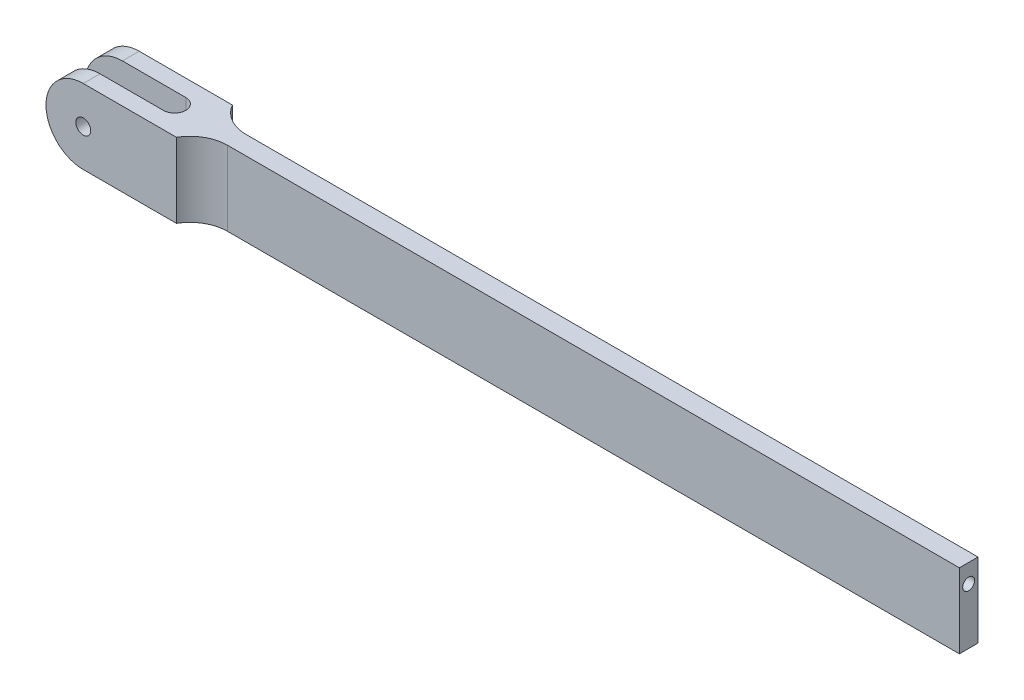
ISO-10303-21;
HEADER;
FILE_DESCRIPTION(('STEP AP214'),'2;1');
FILE_NAME('part.step','',(''),(''),'','','');
FILE_SCHEMA(('AUTOMOTIVE_DESIGN { 1 0 10303 214 1 1 1 1 }'));
ENDSEC;
DATA;
#1=APPLICATION_CONTEXT('core data for automotive mechanical design processes');
#2=APPLICATION_PROTOCOL_DEFINITION('international standard','automotive_design',2000,#1);
#3=PRODUCT_CONTEXT('',#1,'mechanical');
#4=PRODUCT('Part','Part','',(#3));
#5=PRODUCT_RELATED_PRODUCT_CATEGORY('part','',(#4));
#6=PRODUCT_DEFINITION_FORMATION('','',#4);
#7=PRODUCT_DEFINITION_CONTEXT('part definition',#1,'design');
#8=PRODUCT_DEFINITION('design','',#6,#7);
#9=PRODUCT_DEFINITION_SHAPE('','',#8);
#10=(LENGTH_UNIT() NAMED_UNIT(*) SI_UNIT(.MILLI.,.METRE.));
#11=(NAMED_UNIT(*) PLANE_ANGLE_UNIT() SI_UNIT($,.RADIAN.));
#12=(NAMED_UNIT(*) SI_UNIT($,.STERADIAN.) SOLID_ANGLE_UNIT());
#13=UNCERTAINTY_MEASURE_WITH_UNIT(LENGTH_MEASURE(1.E-05),#10,'distance_accuracy_value','');
#14=(GEOMETRIC_REPRESENTATION_CONTEXT(3) GLOBAL_UNCERTAINTY_ASSIGNED_CONTEXT((#13)) GLOBAL_UNIT_ASSIGNED_CONTEXT((#10,
#11,#12)) REPRESENTATION_CONTEXT('',''));
#15=CARTESIAN_POINT('',(0.,0.,0.));
#16=DIRECTION('',(0.,0.,1.));
#17=DIRECTION('',(1.,0.,0.));
#18=AXIS2_PLACEMENT_3D('',#15,#16,#17);
#19=CARTESIAN_POINT('',(0.,0.,5.));
#20=DIRECTION('',(0.,0.,-1.));
#21=DIRECTION('',(-1.,0.,0.));
#22=AXIS2_PLACEMENT_3D('',#19,#20,#21);
#23=CYLINDRICAL_SURFACE('',#22,10.);
#24=DIRECTION('',(0.,0.,-1.));
#25=VECTOR('',#24,1.);
#26=CARTESIAN_POINT('',(0.,10.,5.));
#27=LINE('',#26,#25);
#28=CARTESIAN_POINT('',(0.,10.,10.));
#29=VERTEX_POINT('',#28);
#30=CARTESIAN_POINT('',(0.,10.,5.5));
#31=VERTEX_POINT('',#30);
#32=EDGE_CURVE('E159',#29,#31,#27,.T.);
#33=ORIENTED_EDGE('',*,*,#32,.T.);
#34=CARTESIAN_POINT('',(0.,0.,5.5));
#35=DIRECTION('',(0.,0.,1.));
#36=DIRECTION('',(1.,0.,0.));
#37=AXIS2_PLACEMENT_3D('',#34,#35,#36);
#38=CIRCLE('',#37,10.);
#39=CARTESIAN_POINT('',(0.,-10.,5.5));
#40=VERTEX_POINT('',#39);
#41=EDGE_CURVE('E187',#31,#40,#38,.T.);
#42=ORIENTED_EDGE('',*,*,#41,.T.);
#43=DIRECTION('',(0.,0.,-1.));
#44=VECTOR('',#43,1.);
#45=CARTESIAN_POINT('',(0.,-10.,5.));
#46=LINE('',#45,#44);
#47=CARTESIAN_POINT('',(0.,-10.,10.));
#48=VERTEX_POINT('',#47);
#49=EDGE_CURVE('E177',#48,#40,#46,.T.);
#50=ORIENTED_EDGE('',*,*,#49,.F.);
#51=CARTESIAN_POINT('',(0.,0.,10.));
#52=DIRECTION('',(0.,0.,1.));
#53=DIRECTION('',(1.,0.,0.));
#54=AXIS2_PLACEMENT_3D('',#51,#52,#53);
#55=CIRCLE('',#54,10.);
#56=EDGE_CURVE('E234',#29,#48,#55,.T.);
#57=ORIENTED_EDGE('',*,*,#56,.F.);
#58=EDGE_LOOP('',(#33,#42,#50,#57));
#59=FACE_BOUND('',#58,.T.);
#60=ADVANCED_FACE('F41',(#59),#23,.T.);
#61=CARTESIAN_POINT('',(0.,10.,5.));
#62=DIRECTION('',(0.,-1.,0.));
#63=DIRECTION('',(1.,0.,0.));
#64=AXIS2_PLACEMENT_3D('',#61,#62,#63);
#65=PLANE('',#64);
#66=CARTESIAN_POINT('',(17.,10.,2.5));
#67=DIRECTION('',(0.,-1.,0.));
#68=DIRECTION('',(1.,0.,0.));
#69=AXIS2_PLACEMENT_3D('',#66,#67,#68);
#70=CIRCLE('',#69,3.);
#71=CARTESIAN_POINT('',(17.,10.,-0.5));
#72=VERTEX_POINT('',#71);
#73=CARTESIAN_POINT('',(20.,10.,2.5));
#74=VERTEX_POINT('',#73);
#75=EDGE_CURVE('E63',#72,#74,#70,.T.);
#76=ORIENTED_EDGE('',*,*,#75,.T.);
#77=CARTESIAN_POINT('',(17.,10.,2.5));
#78=DIRECTION('',(0.,-1.,0.));
#79=DIRECTION('',(1.,0.,0.));
#80=AXIS2_PLACEMENT_3D('',#77,#78,#79);
#81=CIRCLE('',#80,3.);
#82=CARTESIAN_POINT('',(17.,10.,5.5));
#83=VERTEX_POINT('',#82);
#84=EDGE_CURVE('E49',#74,#83,#81,.T.);
#85=ORIENTED_EDGE('',*,*,#84,.T.);
#86=DIRECTION('',(1.,0.,0.));
#87=VECTOR('',#86,1.);
#88=CARTESIAN_POINT('',(-20.,10.,5.5));
#89=LINE('',#88,#87);
#90=EDGE_CURVE('E144',#31,#83,#89,.T.);
#91=ORIENTED_EDGE('',*,*,#90,.F.);
#92=ORIENTED_EDGE('',*,*,#32,.F.);
#93=DIRECTION('',(-1.,0.,0.));
#94=VECTOR('',#93,1.);
#95=CARTESIAN_POINT('',(0.,10.,10.));
#96=LINE('',#95,#94);
#97=CARTESIAN_POINT('',(25.,10.,10.));
#98=VERTEX_POINT('',#97);
#99=EDGE_CURVE('E226',#98,#29,#96,.T.);
#100=ORIENTED_EDGE('',*,*,#99,.F.);
#101=CARTESIAN_POINT('',(33.6602540378444,10.,15.));
#102=DIRECTION('',(0.,-1.,0.));
#103=DIRECTION('',(1.,0.,0.));
#104=AXIS2_PLACEMENT_3D('',#101,#102,#103);
#105=CIRCLE('',#104,10.);
#106=CARTESIAN_POINT('',(33.6602540378444,10.,5.));
#107=VERTEX_POINT('',#106);
#108=EDGE_CURVE('E194',#98,#107,#105,.T.);
#109=ORIENTED_EDGE('',*,*,#108,.T.);
#110=DIRECTION('',(-1.,0.,0.));
#111=VECTOR('',#110,1.);
#112=CARTESIAN_POINT('',(0.,10.,5.));
#113=LINE('',#112,#111);
#114=CARTESIAN_POINT('',(230.,10.,5.));
#115=VERTEX_POINT('',#114);
#116=EDGE_CURVE('E161',#115,#107,#113,.T.);
#117=ORIENTED_EDGE('',*,*,#116,.F.);
#118=DIRECTION('',(0.,0.,-1.));
#119=VECTOR('',#118,1.);
#120=CARTESIAN_POINT('',(230.,10.,5.));
#121=LINE('',#120,#119);
#122=CARTESIAN_POINT('',(230.,10.,0.));
#123=VERTEX_POINT('',#122);
#124=EDGE_CURVE('E163',#115,#123,#121,.T.);
#125=ORIENTED_EDGE('',*,*,#124,.T.);
#126=DIRECTION('',(-1.,0.,0.));
#127=VECTOR('',#126,1.);
#128=CARTESIAN_POINT('',(0.,10.,0.));
#129=LINE('',#128,#127);
#130=CARTESIAN_POINT('',(33.6602540378444,10.,0.));
#131=VERTEX_POINT('',#130);
#132=EDGE_CURVE('E168',#123,#131,#129,.T.);
#133=ORIENTED_EDGE('',*,*,#132,.T.);
#134=CARTESIAN_POINT('',(33.6602540378444,10.,-10.));
#135=DIRECTION('',(0.,-1.,0.));
#136=DIRECTION('',(1.,0.,0.));
#137=AXIS2_PLACEMENT_3D('',#134,#135,#136);
#138=CIRCLE('',#137,10.);
#139=CARTESIAN_POINT('',(25.,10.,-5.));
#140=VERTEX_POINT('',#139);
#141=EDGE_CURVE('E197',#131,#140,#138,.T.);
#142=ORIENTED_EDGE('',*,*,#141,.T.);
#143=DIRECTION('',(-1.,0.,0.));
#144=VECTOR('',#143,1.);
#145=CARTESIAN_POINT('',(0.,10.,-5.));
#146=LINE('',#145,#144);
#147=CARTESIAN_POINT('',(0.,10.,-5.));
#148=VERTEX_POINT('',#147);
#149=EDGE_CURVE('E157',#140,#148,#146,.T.);
#150=ORIENTED_EDGE('',*,*,#149,.T.);
#151=CARTESIAN_POINT('',(0.,10.,-0.5));
#152=VERTEX_POINT('',#151);
#153=EDGE_CURVE('E147',#152,#148,#27,.T.);
#154=ORIENTED_EDGE('',*,*,#153,.F.);
#155=DIRECTION('',(-1.,0.,0.));
#156=VECTOR('',#155,1.);
#157=CARTESIAN_POINT('',(-20.,10.,-0.5));
#158=LINE('',#157,#156);
#159=EDGE_CURVE('E136',#72,#152,#158,.T.);
#160=ORIENTED_EDGE('',*,*,#159,.F.);
#161=EDGE_LOOP('',(#76,#85,#91,#92,#100,#109,#117,#125,#133,#142,#150,#154,#160));
#162=FACE_BOUND('',#161,.T.);
#163=ADVANCED_FACE('F160',(#162),#65,.F.);
#164=CARTESIAN_POINT('',(0.,0.,5.));
#165=DIRECTION('',(0.,0.,-1.));
#166=DIRECTION('',(-1.,0.,0.));
#167=AXIS2_PLACEMENT_3D('',#164,#165,#166);
#168=CYLINDRICAL_SURFACE('',#167,2.);
#169=CARTESIAN_POINT('',(0.,0.,5.5));
#170=DIRECTION('',(0.,0.,1.));
#171=DIRECTION('',(1.,0.,0.));
#172=AXIS2_PLACEMENT_3D('',#169,#170,#171);
#173=CIRCLE('',#172,2.);
#174=CARTESIAN_POINT('',(2.,0.,5.5));
#175=VERTEX_POINT('',#174);
#176=EDGE_CURVE('E153',#175,#175,#173,.T.);
#177=ORIENTED_EDGE('',*,*,#176,.F.);
#178=EDGE_LOOP('',(#177));
#179=FACE_BOUND('',#178,.T.);
#180=CARTESIAN_POINT('',(0.,0.,10.));
#181=DIRECTION('',(0.,0.,1.));
#182=DIRECTION('',(1.,0.,0.));
#183=AXIS2_PLACEMENT_3D('',#180,#181,#182);
#184=CIRCLE('',#183,2.);
#185=CARTESIAN_POINT('',(2.,0.,10.));
#186=VERTEX_POINT('',#185);
#187=EDGE_CURVE('E239',#186,#186,#184,.F.);
#188=ORIENTED_EDGE('',*,*,#187,.F.);
#189=EDGE_LOOP('',(#188));
#190=FACE_BOUND('',#189,.T.);
#191=ADVANCED_FACE('F287',(#179,#190),#168,.F.);
#192=CARTESIAN_POINT('',(0.,0.,5.));
#193=DIRECTION('',(0.,0.,1.));
#194=DIRECTION('',(1.,0.,0.));
#195=AXIS2_PLACEMENT_3D('',#192,#193,#194);
#196=PLANE('',#195);
#197=ORIENTED_EDGE('',*,*,#116,.T.);
#198=DIRECTION('',(0.,-1.,0.));
#199=VECTOR('',#198,1.);
#200=CARTESIAN_POINT('',(33.6602540378444,-9.99999999999999,5.));
#201=LINE('',#200,#199);
#202=CARTESIAN_POINT('',(33.6602540378444,-10.,5.));
#203=VERTEX_POINT('',#202);
#204=EDGE_CURVE('E180',#107,#203,#201,.T.);
#205=ORIENTED_EDGE('',*,*,#204,.T.);
#206=DIRECTION('',(1.,0.,0.));
#207=VECTOR('',#206,1.);
#208=CARTESIAN_POINT('',(0.,-10.,5.));
#209=LINE('',#208,#207);
#210=CARTESIAN_POINT('',(230.,-9.99999999999997,5.));
#211=VERTEX_POINT('',#210);
#212=EDGE_CURVE('E254',#203,#211,#209,.T.);
#213=ORIENTED_EDGE('',*,*,#212,.T.);
#214=DIRECTION('',(0.,1.,0.));
#215=VECTOR('',#214,1.);
#216=CARTESIAN_POINT('',(230.,10.,5.));
#217=LINE('',#216,#215);
#218=EDGE_CURVE('E167',#211,#115,#217,.T.);
#219=ORIENTED_EDGE('',*,*,#218,.T.);
#220=EDGE_LOOP('',(#197,#205,#213,#219));
#221=FACE_BOUND('',#220,.T.);
#222=ADVANCED_FACE('F276',(#221),#196,.T.);
#223=CARTESIAN_POINT('',(0.,0.,0.));
#224=DIRECTION('',(0.,0.,1.));
#225=DIRECTION('',(1.,0.,0.));
#226=AXIS2_PLACEMENT_3D('',#223,#224,#225);
#227=PLANE('',#226);
#228=DIRECTION('',(1.,0.,0.));
#229=VECTOR('',#228,1.);
#230=CARTESIAN_POINT('',(0.,-10.,0.));
#231=LINE('',#230,#229);
#232=CARTESIAN_POINT('',(33.6602540378444,-10.,0.));
#233=VERTEX_POINT('',#232);
#234=CARTESIAN_POINT('',(230.,-9.99999999999997,0.));
#235=VERTEX_POINT('',#234);
#236=EDGE_CURVE('E255',#233,#235,#231,.T.);
#237=ORIENTED_EDGE('',*,*,#236,.F.);
#238=DIRECTION('',(0.,1.,0.));
#239=VECTOR('',#238,1.);
#240=CARTESIAN_POINT('',(33.6602540378444,0.,0.));
#241=LINE('',#240,#239);
#242=EDGE_CURVE('E189',#233,#131,#241,.T.);
#243=ORIENTED_EDGE('',*,*,#242,.T.);
#244=ORIENTED_EDGE('',*,*,#132,.F.);
#245=DIRECTION('',(0.,1.,0.));
#246=VECTOR('',#245,1.);
#247=CARTESIAN_POINT('',(230.,10.,0.));
#248=LINE('',#247,#246);
#249=EDGE_CURVE('E256',#235,#123,#248,.T.);
#250=ORIENTED_EDGE('',*,*,#249,.F.);
#251=EDGE_LOOP('',(#237,#243,#244,#250));
#252=FACE_BOUND('',#251,.T.);
#253=ADVANCED_FACE('F280',(#252),#227,.F.);
#254=CARTESIAN_POINT('',(0.,-10.,-0.5));
#255=VERTEX_POINT('',#254);
#256=CARTESIAN_POINT('',(0.,-10.,-5.));
#257=VERTEX_POINT('',#256);
#258=EDGE_CURVE('E155',#255,#257,#46,.T.);
#259=ORIENTED_EDGE('',*,*,#258,.F.);
#260=CARTESIAN_POINT('',(0.,0.,-0.5));
#261=DIRECTION('',(0.,0.,-1.));
#262=DIRECTION('',(-1.,0.,0.));
#263=AXIS2_PLACEMENT_3D('',#260,#261,#262);
#264=CIRCLE('',#263,10.);
#265=EDGE_CURVE('E140',#255,#152,#264,.T.);
#266=ORIENTED_EDGE('',*,*,#265,.T.);
#267=ORIENTED_EDGE('',*,*,#153,.T.);
#268=CARTESIAN_POINT('',(0.,0.,-5.));
#269=DIRECTION('',(0.,0.,1.));
#270=DIRECTION('',(1.,0.,0.));
#271=AXIS2_PLACEMENT_3D('',#268,#269,#270);
#272=CIRCLE('',#271,10.);
#273=EDGE_CURVE('E246',#148,#257,#272,.T.);
#274=ORIENTED_EDGE('',*,*,#273,.T.);
#275=EDGE_LOOP('',(#259,#266,#267,#274));
#276=FACE_BOUND('',#275,.T.);
#277=ADVANCED_FACE('F146',(#276),#23,.T.);
#278=CARTESIAN_POINT('',(0.,-10.,5.));
#279=DIRECTION('',(0.,1.,0.));
#280=DIRECTION('',(-1.,0.,0.));
#281=AXIS2_PLACEMENT_3D('',#278,#279,#280);
#282=PLANE('',#281);
#283=ORIENTED_EDGE('',*,*,#49,.T.);
#284=DIRECTION('',(1.,0.,0.));
#285=VECTOR('',#284,1.);
#286=CARTESIAN_POINT('',(-20.,-10.,5.5));
#287=LINE('',#286,#285);
#288=CARTESIAN_POINT('',(17.,-10.,5.5));
#289=VERTEX_POINT('',#288);
#290=EDGE_CURVE('E181',#40,#289,#287,.T.);
#291=ORIENTED_EDGE('',*,*,#290,.T.);
#292=CARTESIAN_POINT('',(17.,-10.,2.5));
#293=DIRECTION('',(0.,1.,0.));
#294=DIRECTION('',(-1.,0.,0.));
#295=AXIS2_PLACEMENT_3D('',#292,#293,#294);
#296=CIRCLE('',#295,3.);
#297=CARTESIAN_POINT('',(20.,-10.,2.5));
#298=VERTEX_POINT('',#297);
#299=EDGE_CURVE('E11',#289,#298,#296,.T.);
#300=ORIENTED_EDGE('',*,*,#299,.T.);
#301=CARTESIAN_POINT('',(17.,-10.,2.5));
#302=DIRECTION('',(0.,1.,0.));
#303=DIRECTION('',(-1.,0.,0.));
#304=AXIS2_PLACEMENT_3D('',#301,#302,#303);
#305=CIRCLE('',#304,3.);
#306=CARTESIAN_POINT('',(17.,-10.,-0.5));
#307=VERTEX_POINT('',#306);
#308=EDGE_CURVE('E201',#298,#307,#305,.T.);
#309=ORIENTED_EDGE('',*,*,#308,.T.);
#310=DIRECTION('',(-1.,0.,0.));
#311=VECTOR('',#310,1.);
#312=CARTESIAN_POINT('',(-20.,-10.,-0.5));
#313=LINE('',#312,#311);
#314=EDGE_CURVE('E213',#307,#255,#313,.T.);
#315=ORIENTED_EDGE('',*,*,#314,.T.);
#316=ORIENTED_EDGE('',*,*,#258,.T.);
#317=DIRECTION('',(1.,0.,0.));
#318=VECTOR('',#317,1.);
#319=CARTESIAN_POINT('',(0.,-10.,-5.));
#320=LINE('',#319,#318);
#321=CARTESIAN_POINT('',(25.,-10.,-5.));
#322=VERTEX_POINT('',#321);
#323=EDGE_CURVE('E249',#257,#322,#320,.T.);
#324=ORIENTED_EDGE('',*,*,#323,.T.);
#325=CARTESIAN_POINT('',(33.6602540378444,-10.,-10.));
#326=DIRECTION('',(0.,1.,0.));
#327=DIRECTION('',(-1.,0.,0.));
#328=AXIS2_PLACEMENT_3D('',#325,#326,#327);
#329=CIRCLE('',#328,10.);
#330=EDGE_CURVE('E195',#322,#233,#329,.T.);
#331=ORIENTED_EDGE('',*,*,#330,.T.);
#332=ORIENTED_EDGE('',*,*,#236,.T.);
#333=DIRECTION('',(0.,0.,-1.));
#334=VECTOR('',#333,1.);
#335=CARTESIAN_POINT('',(230.,-9.99999999999997,5.));
#336=LINE('',#335,#334);
#337=EDGE_CURVE('E174',#211,#235,#336,.T.);
#338=ORIENTED_EDGE('',*,*,#337,.F.);
#339=ORIENTED_EDGE('',*,*,#212,.F.);
#340=CARTESIAN_POINT('',(33.6602540378444,-10.,15.));
#341=DIRECTION('',(0.,1.,0.));
#342=DIRECTION('',(-1.,0.,0.));
#343=AXIS2_PLACEMENT_3D('',#340,#341,#342);
#344=CIRCLE('',#343,10.);
#345=CARTESIAN_POINT('',(25.,-10.,10.));
#346=VERTEX_POINT('',#345);
#347=EDGE_CURVE('E191',#203,#346,#344,.T.);
#348=ORIENTED_EDGE('',*,*,#347,.T.);
#349=DIRECTION('',(1.,0.,0.));
#350=VECTOR('',#349,1.);
#351=CARTESIAN_POINT('',(0.,-10.,10.));
#352=LINE('',#351,#350);
#353=EDGE_CURVE('E237',#48,#346,#352,.T.);
#354=ORIENTED_EDGE('',*,*,#353,.F.);
#355=EDGE_LOOP('',(#283,#291,#300,#309,#315,#316,#324,#331,#332,#338,#339,#348,#354));
#356=FACE_BOUND('',#355,.T.);
#357=ADVANCED_FACE('F218',(#356),#282,.F.);
#358=CARTESIAN_POINT('',(230.,10.,5.));
#359=DIRECTION('',(-1.,0.,0.));
#360=DIRECTION('',(0.,0.,1.));
#361=AXIS2_PLACEMENT_3D('',#358,#359,#360);
#362=PLANE('',#361);
#363=CARTESIAN_POINT('',(230.,5.00000000000003,2.5));
#364=DIRECTION('',(1.,0.,0.));
#365=DIRECTION('',(0.,0.,-1.));
#366=AXIS2_PLACEMENT_3D('',#363,#364,#365);
#367=CIRCLE('',#366,1.6);
#368=CARTESIAN_POINT('',(230.,5.00000000000003,0.9));
#369=VERTEX_POINT('',#368);
#370=EDGE_CURVE('E224',#369,#369,#367,.T.);
#371=ORIENTED_EDGE('',*,*,#370,.F.);
#372=EDGE_LOOP('',(#371));
#373=FACE_BOUND('',#372,.T.);
#374=ORIENTED_EDGE('',*,*,#249,.T.);
#375=ORIENTED_EDGE('',*,*,#124,.F.);
#376=ORIENTED_EDGE('',*,*,#218,.F.);
#377=ORIENTED_EDGE('',*,*,#337,.T.);
#378=EDGE_LOOP('',(#374,#375,#376,#377));
#379=FACE_BOUND('',#378,.T.);
#380=ADVANCED_FACE('F344',(#373,#379),#362,.F.);
#381=CARTESIAN_POINT('',(0.,0.,-5.));
#382=DIRECTION('',(0.,0.,1.));
#383=DIRECTION('',(1.,0.,0.));
#384=AXIS2_PLACEMENT_3D('',#381,#382,#383);
#385=PLANE('',#384);
#386=DIRECTION('',(0.,-1.,0.));
#387=VECTOR('',#386,1.);
#388=CARTESIAN_POINT('',(25.,0.,-5.));
#389=LINE('',#388,#387);
#390=EDGE_CURVE('E245',#140,#322,#389,.T.);
#391=ORIENTED_EDGE('',*,*,#390,.T.);
#392=ORIENTED_EDGE('',*,*,#323,.F.);
#393=ORIENTED_EDGE('',*,*,#273,.F.);
#394=ORIENTED_EDGE('',*,*,#149,.F.);
#395=EDGE_LOOP('',(#391,#392,#393,#394));
#396=FACE_BOUND('',#395,.T.);
#397=CARTESIAN_POINT('',(0.,0.,-5.));
#398=DIRECTION('',(0.,0.,1.));
#399=DIRECTION('',(1.,0.,0.));
#400=AXIS2_PLACEMENT_3D('',#397,#398,#399);
#401=CIRCLE('',#400,2.);
#402=CARTESIAN_POINT('',(2.,0.,-5.));
#403=VERTEX_POINT('',#402);
#404=EDGE_CURVE('E253',#403,#403,#401,.F.);
#405=ORIENTED_EDGE('',*,*,#404,.F.);
#406=EDGE_LOOP('',(#405));
#407=FACE_BOUND('',#406,.T.);
#408=ADVANCED_FACE('F272',(#396,#407),#385,.F.);
#409=CARTESIAN_POINT('',(0.,0.,-0.5));
#410=DIRECTION('',(0.,0.,-1.));
#411=DIRECTION('',(-1.,0.,0.));
#412=AXIS2_PLACEMENT_3D('',#409,#410,#411);
#413=CIRCLE('',#412,2.);
#414=CARTESIAN_POINT('',(-2.,0.,-0.5));
#415=VERTEX_POINT('',#414);
#416=EDGE_CURVE('E152',#415,#415,#413,.T.);
#417=ORIENTED_EDGE('',*,*,#416,.F.);
#418=EDGE_LOOP('',(#417));
#419=FACE_BOUND('',#418,.T.);
#420=ORIENTED_EDGE('',*,*,#404,.T.);
#421=EDGE_LOOP('',(#420));
#422=FACE_BOUND('',#421,.T.);
#423=ADVANCED_FACE('F365',(#419,#422),#168,.F.);
#424=CARTESIAN_POINT('',(0.,0.,10.));
#425=DIRECTION('',(0.,0.,1.));
#426=DIRECTION('',(1.,0.,0.));
#427=AXIS2_PLACEMENT_3D('',#424,#425,#426);
#428=PLANE('',#427);
#429=DIRECTION('',(0.,-1.,0.));
#430=VECTOR('',#429,1.);
#431=CARTESIAN_POINT('',(25.,0.,10.));
#432=LINE('',#431,#430);
#433=EDGE_CURVE('E230',#98,#346,#432,.T.);
#434=ORIENTED_EDGE('',*,*,#433,.F.);
#435=ORIENTED_EDGE('',*,*,#99,.T.);
#436=ORIENTED_EDGE('',*,*,#56,.T.);
#437=ORIENTED_EDGE('',*,*,#353,.T.);
#438=EDGE_LOOP('',(#434,#435,#436,#437));
#439=FACE_BOUND('',#438,.T.);
#440=ORIENTED_EDGE('',*,*,#187,.T.);
#441=EDGE_LOOP('',(#440));
#442=FACE_BOUND('',#441,.T.);
#443=ADVANCED_FACE('F331',(#439,#442),#428,.T.);
#444=CARTESIAN_POINT('',(-20.,-10.,5.5));
#445=DIRECTION('',(0.,0.,1.));
#446=DIRECTION('',(1.,0.,0.));
#447=AXIS2_PLACEMENT_3D('',#444,#445,#446);
#448=PLANE('',#447);
#449=ORIENTED_EDGE('',*,*,#176,.T.);
#450=EDGE_LOOP('',(#449));
#451=FACE_BOUND('',#450,.T.);
#452=ORIENTED_EDGE('',*,*,#90,.T.);
#453=DIRECTION('',(0.,1.,0.));
#454=VECTOR('',#453,1.);
#455=CARTESIAN_POINT('',(17.,-10.,5.5));
#456=LINE('',#455,#454);
#457=EDGE_CURVE('E199',#83,#289,#456,.F.);
#458=ORIENTED_EDGE('',*,*,#457,.T.);
#459=ORIENTED_EDGE('',*,*,#290,.F.);
#460=ORIENTED_EDGE('',*,*,#41,.F.);
#461=EDGE_LOOP('',(#452,#458,#459,#460));
#462=FACE_BOUND('',#461,.T.);
#463=ADVANCED_FACE('F211',(#451,#462),#448,.F.);
#464=CARTESIAN_POINT('',(-20.,-10.,-0.5));
#465=DIRECTION('',(0.,0.,-1.));
#466=DIRECTION('',(-1.,0.,0.));
#467=AXIS2_PLACEMENT_3D('',#464,#465,#466);
#468=PLANE('',#467);
#469=ORIENTED_EDGE('',*,*,#416,.T.);
#470=EDGE_LOOP('',(#469));
#471=FACE_BOUND('',#470,.T.);
#472=ORIENTED_EDGE('',*,*,#314,.F.);
#473=DIRECTION('',(0.,1.,0.));
#474=VECTOR('',#473,1.);
#475=CARTESIAN_POINT('',(17.,10.,-0.5));
#476=LINE('',#475,#474);
#477=EDGE_CURVE('E141',#307,#72,#476,.T.);
#478=ORIENTED_EDGE('',*,*,#477,.T.);
#479=ORIENTED_EDGE('',*,*,#159,.T.);
#480=ORIENTED_EDGE('',*,*,#265,.F.);
#481=EDGE_LOOP('',(#472,#478,#479,#480));
#482=FACE_BOUND('',#481,.T.);
#483=ADVANCED_FACE('F138',(#471,#482),#468,.F.);
#484=CARTESIAN_POINT('',(33.6602540378444,0.,15.));
#485=DIRECTION('',(0.,1.,0.));
#486=DIRECTION('',(-1.,0.,0.));
#487=AXIS2_PLACEMENT_3D('',#484,#485,#486);
#488=CYLINDRICAL_SURFACE('',#487,10.);
#489=ORIENTED_EDGE('',*,*,#108,.F.);
#490=ORIENTED_EDGE('',*,*,#433,.T.);
#491=ORIENTED_EDGE('',*,*,#347,.F.);
#492=ORIENTED_EDGE('',*,*,#204,.F.);
#493=EDGE_LOOP('',(#489,#490,#491,#492));
#494=FACE_BOUND('',#493,.T.);
#495=ADVANCED_FACE('F296',(#494),#488,.F.);
#496=CARTESIAN_POINT('',(33.6602540378444,0.,-10.));
#497=DIRECTION('',(0.,1.,0.));
#498=DIRECTION('',(-1.,0.,0.));
#499=AXIS2_PLACEMENT_3D('',#496,#497,#498);
#500=CYLINDRICAL_SURFACE('',#499,10.);
#501=ORIENTED_EDGE('',*,*,#141,.F.);
#502=ORIENTED_EDGE('',*,*,#242,.F.);
#503=ORIENTED_EDGE('',*,*,#330,.F.);
#504=ORIENTED_EDGE('',*,*,#390,.F.);
#505=EDGE_LOOP('',(#501,#502,#503,#504));
#506=FACE_BOUND('',#505,.T.);
#507=ADVANCED_FACE('F269',(#506),#500,.F.);
#508=CARTESIAN_POINT('',(17.,-10.,2.5));
#509=DIRECTION('',(0.,-1.,0.));
#510=DIRECTION('',(0.,0.,-1.));
#511=AXIS2_PLACEMENT_3D('',#508,#509,#510);
#512=CYLINDRICAL_SURFACE('',#511,3.);
#513=DIRECTION('',(0.,1.,0.));
#514=VECTOR('',#513,1.);
#515=CARTESIAN_POINT('',(20.,10.,2.5));
#516=LINE('',#515,#514);
#517=EDGE_CURVE('E44',#298,#74,#516,.T.);
#518=ORIENTED_EDGE('',*,*,#517,.F.);
#519=ORIENTED_EDGE('',*,*,#299,.F.);
#520=ORIENTED_EDGE('',*,*,#457,.F.);
#521=ORIENTED_EDGE('',*,*,#84,.F.);
#522=EDGE_LOOP('',(#518,#519,#520,#521));
#523=FACE_BOUND('',#522,.T.);
#524=ADVANCED_FACE('F43',(#523),#512,.F.);
#525=CARTESIAN_POINT('',(17.,-10.,2.5));
#526=DIRECTION('',(0.,-1.,0.));
#527=DIRECTION('',(0.,0.,-1.));
#528=AXIS2_PLACEMENT_3D('',#525,#526,#527);
#529=CYLINDRICAL_SURFACE('',#528,3.);
#530=ORIENTED_EDGE('',*,*,#308,.F.);
#531=ORIENTED_EDGE('',*,*,#517,.T.);
#532=ORIENTED_EDGE('',*,*,#75,.F.);
#533=ORIENTED_EDGE('',*,*,#477,.F.);
#534=EDGE_LOOP('',(#530,#531,#532,#533));
#535=FACE_BOUND('',#534,.T.);
#536=ADVANCED_FACE('F217',(#535),#529,.F.);
#537=CARTESIAN_POINT('',(210.,5.00000000000003,2.5));
#538=DIRECTION('',(1.,0.,0.));
#539=DIRECTION('',(0.,0.,-1.));
#540=AXIS2_PLACEMENT_3D('',#537,#538,#539);
#541=CYLINDRICAL_SURFACE('',#540,1.6);
#542=CARTESIAN_POINT('',(210.,5.00000000000003,2.5));
#543=DIRECTION('',(1.,0.,0.));
#544=DIRECTION('',(0.,0.,-1.));
#545=AXIS2_PLACEMENT_3D('',#542,#543,#544);
#546=CIRCLE('',#545,1.6);
#547=CARTESIAN_POINT('',(210.,5.00000000000003,0.9));
#548=VERTEX_POINT('',#547);
#549=EDGE_CURVE('E220',#548,#548,#546,.T.);
#550=ORIENTED_EDGE('',*,*,#549,.F.);
#551=EDGE_LOOP('',(#550));
#552=FACE_BOUND('',#551,.T.);
#553=ORIENTED_EDGE('',*,*,#370,.T.);
#554=EDGE_LOOP('',(#553));
#555=FACE_BOUND('',#554,.T.);
#556=ADVANCED_FACE('F308',(#552,#555),#541,.F.);
#557=CARTESIAN_POINT('',(210.,5.00000000000003,2.5));
#558=DIRECTION('',(1.,0.,0.));
#559=DIRECTION('',(0.,0.,-1.));
#560=AXIS2_PLACEMENT_3D('',#557,#558,#559);
#561=PLANE('',#560);
#562=ORIENTED_EDGE('',*,*,#549,.T.);
#563=EDGE_LOOP('',(#562));
#564=FACE_BOUND('',#563,.T.);
#565=ADVANCED_FACE('F315',(#564),#561,.T.);
#566=CLOSED_SHELL('',(#60,#163,#191,#222,#253,#277,#357,#380,#408,#423,#443,#463,#483,#495,#507,
#524,#536,#556,#565));
#567=MANIFOLD_SOLID_BREP('B2',#566);
#568=ADVANCED_BREP_SHAPE_REPRESENTATION('',(#18,#567),#14);
#569=SHAPE_DEFINITION_REPRESENTATION(#9,#568);
ENDSEC;
END-ISO-10303-21;
